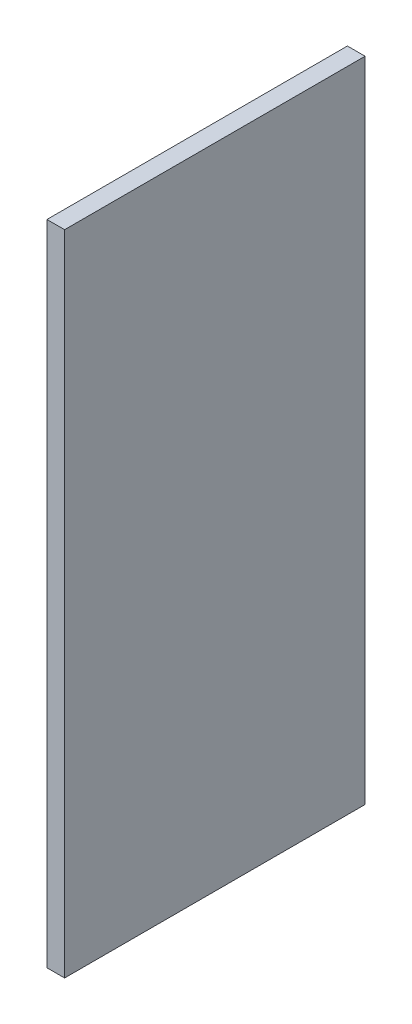
ISO-10303-21;
HEADER;
FILE_DESCRIPTION(('STEP AP214'),'2;1');
FILE_NAME('part.step','',(''),(''),'','','');
FILE_SCHEMA(('AUTOMOTIVE_DESIGN { 1 0 10303 214 1 1 1 1 }'));
ENDSEC;
DATA;
#1=APPLICATION_CONTEXT('core data for automotive mechanical design processes');
#2=APPLICATION_PROTOCOL_DEFINITION('international standard','automotive_design',2000,#1);
#3=PRODUCT_CONTEXT('',#1,'mechanical');
#4=PRODUCT('Part','Part','',(#3));
#5=PRODUCT_RELATED_PRODUCT_CATEGORY('part','',(#4));
#6=PRODUCT_DEFINITION_FORMATION('','',#4);
#7=PRODUCT_DEFINITION_CONTEXT('part definition',#1,'design');
#8=PRODUCT_DEFINITION('design','',#6,#7);
#9=PRODUCT_DEFINITION_SHAPE('','',#8);
#10=(LENGTH_UNIT() NAMED_UNIT(*) SI_UNIT(.MILLI.,.METRE.));
#11=(NAMED_UNIT(*) PLANE_ANGLE_UNIT() SI_UNIT($,.RADIAN.));
#12=(NAMED_UNIT(*) SI_UNIT($,.STERADIAN.) SOLID_ANGLE_UNIT());
#13=UNCERTAINTY_MEASURE_WITH_UNIT(LENGTH_MEASURE(1.E-05),#10,'distance_accuracy_value','');
#14=(GEOMETRIC_REPRESENTATION_CONTEXT(3) GLOBAL_UNCERTAINTY_ASSIGNED_CONTEXT((#13)) GLOBAL_UNIT_ASSIGNED_CONTEXT((#10,
#11,#12)) REPRESENTATION_CONTEXT('',''));
#15=CARTESIAN_POINT('',(0.,0.,0.));
#16=DIRECTION('',(0.,0.,1.));
#17=DIRECTION('',(1.,0.,0.));
#18=AXIS2_PLACEMENT_3D('',#15,#16,#17);
#19=CARTESIAN_POINT('',(11.8,-5.5,0.3));
#20=DIRECTION('',(1.,0.,0.));
#21=DIRECTION('',(0.,0.,-1.));
#22=AXIS2_PLACEMENT_3D('',#19,#20,#21);
#23=PLANE('',#22);
#24=DIRECTION('',(0.,0.,1.));
#25=VECTOR('',#24,1.);
#26=CARTESIAN_POINT('',(11.8,5.5,0.3));
#27=LINE('',#26,#25);
#28=CARTESIAN_POINT('',(11.8,5.5,5.4));
#29=VERTEX_POINT('',#28);
#30=CARTESIAN_POINT('',(11.8,5.5,0.3));
#31=VERTEX_POINT('',#30);
#32=EDGE_CURVE('E76',#29,#31,#27,.F.);
#33=ORIENTED_EDGE('',*,*,#32,.F.);
#34=DIRECTION('',(0.,1.,0.));
#35=VECTOR('',#34,1.);
#36=CARTESIAN_POINT('',(11.8,-5.5,5.4));
#37=LINE('',#36,#35);
#38=CARTESIAN_POINT('',(11.8,-5.5,5.4));
#39=VERTEX_POINT('',#38);
#40=EDGE_CURVE('E58',#39,#29,#37,.T.);
#41=ORIENTED_EDGE('',*,*,#40,.F.);
#42=DIRECTION('',(0.,0.,1.));
#43=VECTOR('',#42,1.);
#44=CARTESIAN_POINT('',(11.8,-5.5,0.3));
#45=LINE('',#44,#43);
#46=CARTESIAN_POINT('',(11.8,-5.5,0.3));
#47=VERTEX_POINT('',#46);
#48=EDGE_CURVE('E20',#39,#47,#45,.F.);
#49=ORIENTED_EDGE('',*,*,#48,.T.);
#50=DIRECTION('',(0.,1.,0.));
#51=VECTOR('',#50,1.);
#52=CARTESIAN_POINT('',(11.8,-5.5,0.3));
#53=LINE('',#52,#51);
#54=EDGE_CURVE('E55',#47,#31,#53,.T.);
#55=ORIENTED_EDGE('',*,*,#54,.T.);
#56=EDGE_LOOP('',(#33,#41,#49,#55));
#57=FACE_BOUND('',#56,.T.);
#58=ADVANCED_FACE('F17',(#57),#23,.T.);
#59=CARTESIAN_POINT('',(11.5,-5.5,0.3));
#60=DIRECTION('',(0.,1.,0.));
#61=DIRECTION('',(0.,0.,1.));
#62=AXIS2_PLACEMENT_3D('',#59,#60,#61);
#63=PLANE('',#62);
#64=DIRECTION('',(1.,0.,0.));
#65=VECTOR('',#64,1.);
#66=CARTESIAN_POINT('',(11.5,-5.5,5.4));
#67=LINE('',#66,#65);
#68=CARTESIAN_POINT('',(11.5,-5.5,5.4));
#69=VERTEX_POINT('',#68);
#70=EDGE_CURVE('E78',#69,#39,#67,.T.);
#71=ORIENTED_EDGE('',*,*,#70,.F.);
#72=DIRECTION('',(0.,0.,-1.));
#73=VECTOR('',#72,1.);
#74=CARTESIAN_POINT('',(11.5,-5.5,0.3));
#75=LINE('',#74,#73);
#76=CARTESIAN_POINT('',(11.5,-5.5,0.3));
#77=VERTEX_POINT('',#76);
#78=EDGE_CURVE('E73',#69,#77,#75,.T.);
#79=ORIENTED_EDGE('',*,*,#78,.T.);
#80=DIRECTION('',(1.,0.,0.));
#81=VECTOR('',#80,1.);
#82=CARTESIAN_POINT('',(11.5,-5.5,0.3));
#83=LINE('',#82,#81);
#84=EDGE_CURVE('E63',#77,#47,#83,.T.);
#85=ORIENTED_EDGE('',*,*,#84,.T.);
#86=ORIENTED_EDGE('',*,*,#48,.F.);
#87=EDGE_LOOP('',(#71,#79,#85,#86));
#88=FACE_BOUND('',#87,.T.);
#89=ADVANCED_FACE('F72',(#88),#63,.F.);
#90=CARTESIAN_POINT('',(11.5,-5.5,0.3));
#91=DIRECTION('',(0.,0.,1.));
#92=DIRECTION('',(1.,0.,0.));
#93=AXIS2_PLACEMENT_3D('',#90,#91,#92);
#94=PLANE('',#93);
#95=ORIENTED_EDGE('',*,*,#54,.F.);
#96=ORIENTED_EDGE('',*,*,#84,.F.);
#97=DIRECTION('',(0.,1.,0.));
#98=VECTOR('',#97,1.);
#99=CARTESIAN_POINT('',(11.5,-5.5,0.3));
#100=LINE('',#99,#98);
#101=CARTESIAN_POINT('',(11.5,5.5,0.3));
#102=VERTEX_POINT('',#101);
#103=EDGE_CURVE('E83',#77,#102,#100,.T.);
#104=ORIENTED_EDGE('',*,*,#103,.T.);
#105=DIRECTION('',(1.,0.,0.));
#106=VECTOR('',#105,1.);
#107=CARTESIAN_POINT('',(11.5,5.5,0.3));
#108=LINE('',#107,#106);
#109=EDGE_CURVE('E69',#31,#102,#108,.F.);
#110=ORIENTED_EDGE('',*,*,#109,.F.);
#111=EDGE_LOOP('',(#95,#96,#104,#110));
#112=FACE_BOUND('',#111,.T.);
#113=ADVANCED_FACE('F66',(#112),#94,.F.);
#114=CARTESIAN_POINT('',(11.5,5.5,0.3));
#115=DIRECTION('',(0.,1.,0.));
#116=DIRECTION('',(0.,0.,1.));
#117=AXIS2_PLACEMENT_3D('',#114,#115,#116);
#118=PLANE('',#117);
#119=DIRECTION('',(1.,0.,0.));
#120=VECTOR('',#119,1.);
#121=CARTESIAN_POINT('',(11.5,5.5,5.4));
#122=LINE('',#121,#120);
#123=CARTESIAN_POINT('',(11.5,5.5,5.4));
#124=VERTEX_POINT('',#123);
#125=EDGE_CURVE('E34',#29,#124,#122,.F.);
#126=ORIENTED_EDGE('',*,*,#125,.F.);
#127=ORIENTED_EDGE('',*,*,#32,.T.);
#128=ORIENTED_EDGE('',*,*,#109,.T.);
#129=DIRECTION('',(0.,0.,-1.));
#130=VECTOR('',#129,1.);
#131=CARTESIAN_POINT('',(11.5,5.5,0.3));
#132=LINE('',#131,#130);
#133=EDGE_CURVE('E26',#102,#124,#132,.F.);
#134=ORIENTED_EDGE('',*,*,#133,.T.);
#135=EDGE_LOOP('',(#126,#127,#128,#134));
#136=FACE_BOUND('',#135,.T.);
#137=ADVANCED_FACE('F88',(#136),#118,.T.);
#138=CARTESIAN_POINT('',(11.5,-5.5,5.4));
#139=DIRECTION('',(0.,0.,1.));
#140=DIRECTION('',(1.,0.,0.));
#141=AXIS2_PLACEMENT_3D('',#138,#139,#140);
#142=PLANE('',#141);
#143=ORIENTED_EDGE('',*,*,#40,.T.);
#144=ORIENTED_EDGE('',*,*,#125,.T.);
#145=DIRECTION('',(0.,1.,0.));
#146=VECTOR('',#145,1.);
#147=CARTESIAN_POINT('',(11.5,-5.5,5.4));
#148=LINE('',#147,#146);
#149=EDGE_CURVE('E11',#124,#69,#148,.F.);
#150=ORIENTED_EDGE('',*,*,#149,.T.);
#151=ORIENTED_EDGE('',*,*,#70,.T.);
#152=EDGE_LOOP('',(#143,#144,#150,#151));
#153=FACE_BOUND('',#152,.T.);
#154=ADVANCED_FACE('F91',(#153),#142,.T.);
#155=CARTESIAN_POINT('',(11.5,-5.5,0.3));
#156=DIRECTION('',(1.,0.,0.));
#157=DIRECTION('',(0.,0.,-1.));
#158=AXIS2_PLACEMENT_3D('',#155,#156,#157);
#159=PLANE('',#158);
#160=ORIENTED_EDGE('',*,*,#133,.F.);
#161=ORIENTED_EDGE('',*,*,#103,.F.);
#162=ORIENTED_EDGE('',*,*,#78,.F.);
#163=ORIENTED_EDGE('',*,*,#149,.F.);
#164=EDGE_LOOP('',(#160,#161,#162,#163));
#165=FACE_BOUND('',#164,.T.);
#166=ADVANCED_FACE('F90',(#165),#159,.F.);
#167=CLOSED_SHELL('',(#58,#89,#113,#137,#154,#166));
#168=MANIFOLD_SOLID_BREP('B1',#167);
#169=ADVANCED_BREP_SHAPE_REPRESENTATION('',(#18,#168),#14);
#170=SHAPE_DEFINITION_REPRESENTATION(#9,#169);
ENDSEC;
END-ISO-10303-21;
